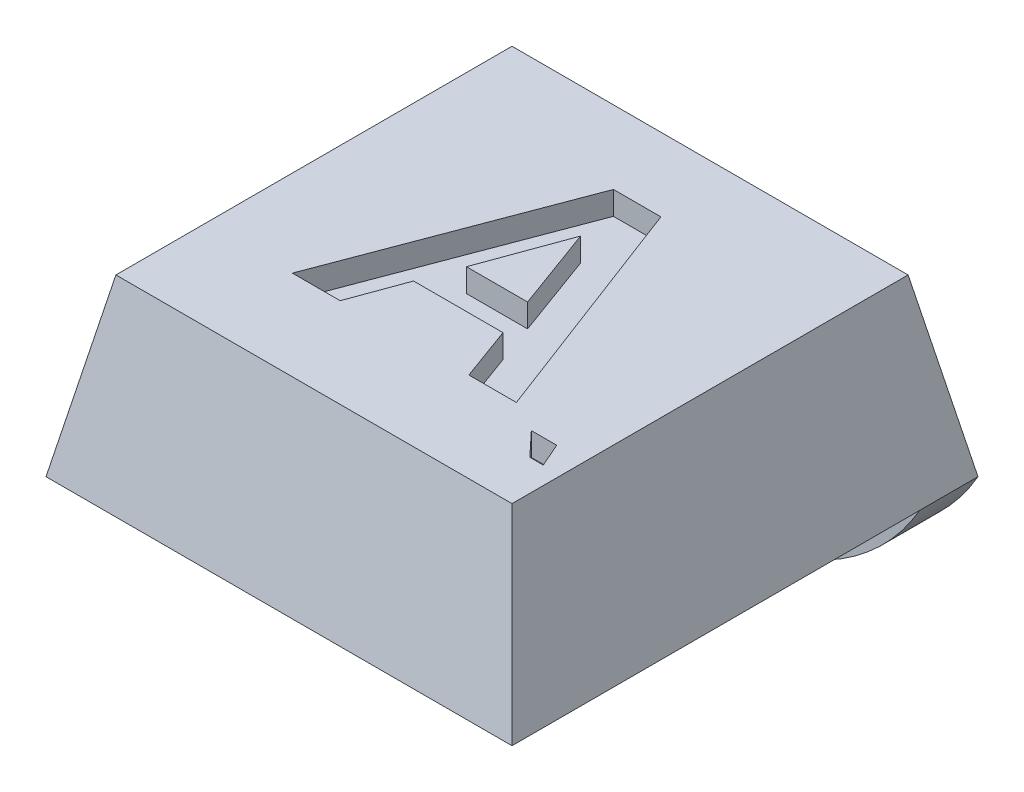
ISO-10303-21;
HEADER;
FILE_DESCRIPTION(('STEP AP214'),'2;1');
FILE_NAME('part.step','',(''),(''),'','','');
FILE_SCHEMA(('AUTOMOTIVE_DESIGN { 1 0 10303 214 1 1 1 1 }'));
ENDSEC;
DATA;
#1=APPLICATION_CONTEXT('core data for automotive mechanical design processes');
#2=APPLICATION_PROTOCOL_DEFINITION('international standard','automotive_design',2000,#1);
#3=PRODUCT_CONTEXT('',#1,'mechanical');
#4=PRODUCT('Part','Part','',(#3));
#5=PRODUCT_RELATED_PRODUCT_CATEGORY('part','',(#4));
#6=PRODUCT_DEFINITION_FORMATION('','',#4);
#7=PRODUCT_DEFINITION_CONTEXT('part definition',#1,'design');
#8=PRODUCT_DEFINITION('design','',#6,#7);
#9=PRODUCT_DEFINITION_SHAPE('','',#8);
#10=(LENGTH_UNIT() NAMED_UNIT(*) SI_UNIT(.MILLI.,.METRE.));
#11=(NAMED_UNIT(*) PLANE_ANGLE_UNIT() SI_UNIT($,.RADIAN.));
#12=(NAMED_UNIT(*) SI_UNIT($,.STERADIAN.) SOLID_ANGLE_UNIT());
#13=UNCERTAINTY_MEASURE_WITH_UNIT(LENGTH_MEASURE(1.E-05),#10,'distance_accuracy_value','');
#14=(GEOMETRIC_REPRESENTATION_CONTEXT(3) GLOBAL_UNCERTAINTY_ASSIGNED_CONTEXT((#13)) GLOBAL_UNIT_ASSIGNED_CONTEXT((#10,
#11,#12)) REPRESENTATION_CONTEXT('',''));
#15=CARTESIAN_POINT('',(0.,0.,0.));
#16=DIRECTION('',(0.,0.,1.));
#17=DIRECTION('',(1.,0.,0.));
#18=AXIS2_PLACEMENT_3D('',#15,#16,#17);
#19=CARTESIAN_POINT('',(0.,3.,0.));
#20=DIRECTION('',(0.,-1.,0.));
#21=DIRECTION('',(0.,0.,-1.));
#22=AXIS2_PLACEMENT_3D('',#19,#20,#21);
#23=PLANE('',#22);
#24=DIRECTION('',(0.355060662326772,0.,0.934843262835045));
#25=VECTOR('',#24,1.);
#26=CARTESIAN_POINT('',(4.41462653323797,3.,-6.14165206843505));
#27=LINE('',#26,#25);
#28=CARTESIAN_POINT('',(4.41462653323797,3.,-6.14165206843505));
#29=VERTEX_POINT('',#28);
#30=CARTESIAN_POINT('',(5.93385730246874,3.,-2.14165206843505));
#31=VERTEX_POINT('',#30);
#32=EDGE_CURVE('E66',#29,#31,#27,.T.);
#33=ORIENTED_EDGE('',*,*,#32,.T.);
#34=DIRECTION('',(-1.,0.,0.));
#35=VECTOR('',#34,1.);
#36=CARTESIAN_POINT('',(5.93385730246874,3.,-2.14165206843505));
#37=LINE('',#36,#35);
#38=CARTESIAN_POINT('',(5.11815217426361,3.,-2.14165206843505));
#39=VERTEX_POINT('',#38);
#40=EDGE_CURVE('E286',#31,#39,#37,.T.);
#41=ORIENTED_EDGE('',*,*,#40,.T.);
#42=DIRECTION('',(-0.343248282132193,0.,-0.939244705501872));
#43=VECTOR('',#42,1.);
#44=CARTESIAN_POINT('',(5.11815217426361,3.,-2.14165206843505));
#45=LINE('',#44,#43);
#46=CARTESIAN_POINT('',(4.78081243067387,3.,-3.06472899151198));
#47=VERTEX_POINT('',#46);
#48=EDGE_CURVE('E290',#39,#47,#45,.T.);
#49=ORIENTED_EDGE('',*,*,#48,.T.);
#50=DIRECTION('',(-1.,0.,0.));
#51=VECTOR('',#50,1.);
#52=CARTESIAN_POINT('',(4.78081243067387,3.,-3.06472899151198));
#53=LINE('',#52,#51);
#54=CARTESIAN_POINT('',(3.24555602041746,3.,-3.06472899151198));
#55=VERTEX_POINT('',#54);
#56=EDGE_CURVE('E294',#47,#55,#53,.T.);
#57=ORIENTED_EDGE('',*,*,#56,.T.);
#58=DIRECTION('',(-0.343248282132194,0.,0.939244705501872));
#59=VECTOR('',#58,1.);
#60=CARTESIAN_POINT('',(3.24555602041746,3.,-3.06472899151198));
#61=LINE('',#60,#59);
#62=CARTESIAN_POINT('',(2.90821627682771,3.,-2.14165206843505));
#63=VERTEX_POINT('',#62);
#64=EDGE_CURVE('E298',#55,#63,#61,.T.);
#65=ORIENTED_EDGE('',*,*,#64,.T.);
#66=DIRECTION('',(-1.,0.,0.));
#67=VECTOR('',#66,1.);
#68=CARTESIAN_POINT('',(2.90821627682771,3.,-2.14165206843505));
#69=LINE('',#68,#67);
#70=CARTESIAN_POINT('',(2.08770345631489,3.,-2.14165206843505));
#71=VERTEX_POINT('',#70);
#72=EDGE_CURVE('E302',#63,#71,#69,.T.);
#73=ORIENTED_EDGE('',*,*,#72,.T.);
#74=DIRECTION('',(0.353586403368764,0.,-0.935401868371419));
#75=VECTOR('',#74,1.);
#76=CARTESIAN_POINT('',(2.08770345631489,3.,-2.14165206843505));
#77=LINE('',#76,#75);
#78=CARTESIAN_POINT('',(3.59972268708412,3.,-6.14165206843505));
#79=VERTEX_POINT('',#78);
#80=EDGE_CURVE('E306',#71,#79,#77,.T.);
#81=ORIENTED_EDGE('',*,*,#80,.T.);
#82=DIRECTION('',(1.,0.,0.));
#83=VECTOR('',#82,1.);
#84=CARTESIAN_POINT('',(3.59972268708412,3.,-6.14165206843505));
#85=LINE('',#84,#83);
#86=EDGE_CURVE('E262',#79,#29,#85,.T.);
#87=ORIENTED_EDGE('',*,*,#86,.T.);
#88=EDGE_LOOP('',(#33,#41,#49,#57,#65,#73,#81,#87));
#89=FACE_BOUND('',#88,.T.);
#90=DIRECTION('',(-1.,0.,0.));
#91=VECTOR('',#90,1.);
#92=CARTESIAN_POINT('',(11.,3.,-0.6));
#93=LINE('',#92,#91);
#94=CARTESIAN_POINT('',(7.4,3.,-0.6));
#95=VERTEX_POINT('',#94);
#96=CARTESIAN_POINT('',(0.6,3.,-0.6));
#97=VERTEX_POINT('',#96);
#98=EDGE_CURVE('E361',#95,#97,#93,.T.);
#99=ORIENTED_EDGE('',*,*,#98,.F.);
#100=DIRECTION('',(0.,0.,1.));
#101=VECTOR('',#100,1.);
#102=CARTESIAN_POINT('',(7.4,3.,-8.));
#103=LINE('',#102,#101);
#104=CARTESIAN_POINT('',(7.4,3.,-7.4));
#105=VERTEX_POINT('',#104);
#106=EDGE_CURVE('E374',#105,#95,#103,.T.);
#107=ORIENTED_EDGE('',*,*,#106,.F.);
#108=DIRECTION('',(-1.,0.,0.));
#109=VECTOR('',#108,1.);
#110=CARTESIAN_POINT('',(11.,3.,-7.4));
#111=LINE('',#110,#109);
#112=CARTESIAN_POINT('',(0.599999999999999,3.,-7.4));
#113=VERTEX_POINT('',#112);
#114=EDGE_CURVE('E357',#105,#113,#111,.T.);
#115=ORIENTED_EDGE('',*,*,#114,.T.);
#116=DIRECTION('',(0.,0.,1.));
#117=VECTOR('',#116,1.);
#118=CARTESIAN_POINT('',(0.6,3.,-8.));
#119=LINE('',#118,#117);
#120=EDGE_CURVE('E377',#113,#97,#119,.T.);
#121=ORIENTED_EDGE('',*,*,#120,.T.);
#122=EDGE_LOOP('',(#99,#107,#115,#121));
#123=FACE_BOUND('',#122,.T.);
#124=DIRECTION('',(0.400818834019709,0.,0.916157334902188));
#125=VECTOR('',#124,1.);
#126=CARTESIAN_POINT('',(6.91610453258598,3.,-1.85152273990893));
#127=LINE('',#126,#125);
#128=CARTESIAN_POINT('',(6.91610453258598,3.,-1.85152273990893));
#129=VERTEX_POINT('',#128);
#130=CARTESIAN_POINT('',(7.09559171207316,3.,-1.44126632965252));
#131=VERTEX_POINT('',#130);
#132=EDGE_CURVE('E58',#129,#131,#127,.T.);
#133=ORIENTED_EDGE('',*,*,#132,.T.);
#134=DIRECTION('',(-1.,0.,0.));
#135=VECTOR('',#134,1.);
#136=CARTESIAN_POINT('',(7.09559171207316,3.,-1.44126632965252));
#137=LINE('',#136,#135);
#138=CARTESIAN_POINT('',(6.86482248130392,3.,-1.44126632965252));
#139=VERTEX_POINT('',#138);
#140=EDGE_CURVE('E214',#131,#139,#137,.T.);
#141=ORIENTED_EDGE('',*,*,#140,.T.);
#142=DIRECTION('',(-0.68394112888133,0.,-0.729537204140085));
#143=VECTOR('',#142,1.);
#144=CARTESIAN_POINT('',(6.86482248130392,3.,-1.44126632965252));
#145=LINE('',#144,#143);
#146=CARTESIAN_POINT('',(6.48020709668854,3.,-1.85152273990893));
#147=VERTEX_POINT('',#146);
#148=EDGE_CURVE('E481',#139,#147,#145,.T.);
#149=ORIENTED_EDGE('',*,*,#148,.T.);
#150=DIRECTION('',(1.,0.,0.));
#151=VECTOR('',#150,1.);
#152=CARTESIAN_POINT('',(6.48020709668854,3.,-1.85152273990893));
#153=LINE('',#152,#151);
#154=EDGE_CURVE('E210',#147,#129,#153,.T.);
#155=ORIENTED_EDGE('',*,*,#154,.T.);
#156=EDGE_LOOP('',(#133,#141,#149,#155));
#157=FACE_BOUND('',#156,.T.);
#158=ADVANCED_FACE('F42',(#89,#123,#157),#23,.F.);
#159=CARTESIAN_POINT('',(8.,0.,-8.));
#160=DIRECTION('',(-0.98058067569092,-0.196116135138184,0.));
#161=DIRECTION('',(0.196116135138184,-0.98058067569092,0.));
#162=AXIS2_PLACEMENT_3D('',#159,#160,#161);
#163=PLANE('',#162);
#164=DIRECTION('',(-0.192450089729875,0.962250448649376,-0.192450089729875));
#165=VECTOR('',#164,1.);
#166=CARTESIAN_POINT('',(7.7037037037037,1.48148148148148,-0.296296296296296));
#167=LINE('',#166,#165);
#168=CARTESIAN_POINT('',(8.,0.,0.));
#169=VERTEX_POINT('',#168);
#170=EDGE_CURVE('E371',#169,#95,#167,.T.);
#171=ORIENTED_EDGE('',*,*,#170,.F.);
#172=DIRECTION('',(0.,0.,-1.));
#173=VECTOR('',#172,1.);
#174=CARTESIAN_POINT('',(8.,0.,0.));
#175=LINE('',#174,#173);
#176=CARTESIAN_POINT('',(8.,0.,-7.));
#177=VERTEX_POINT('',#176);
#178=EDGE_CURVE('E390',#169,#177,#175,.T.);
#179=ORIENTED_EDGE('',*,*,#178,.T.);
#180=DIRECTION('',(0.,0.,1.));
#181=VECTOR('',#180,1.);
#182=CARTESIAN_POINT('',(8.,0.,-8.));
#183=LINE('',#182,#181);
#184=CARTESIAN_POINT('',(8.,0.,-8.));
#185=VERTEX_POINT('',#184);
#186=EDGE_CURVE('E336',#185,#177,#183,.T.);
#187=ORIENTED_EDGE('',*,*,#186,.F.);
#188=DIRECTION('',(0.192450089729875,-0.962250448649376,-0.192450089729875));
#189=VECTOR('',#188,1.);
#190=CARTESIAN_POINT('',(8.,0.,-8.));
#191=LINE('',#190,#189);
#192=EDGE_CURVE('E364',#105,#185,#191,.T.);
#193=ORIENTED_EDGE('',*,*,#192,.F.);
#194=ORIENTED_EDGE('',*,*,#106,.T.);
#195=EDGE_LOOP('',(#171,#179,#187,#193,#194));
#196=FACE_BOUND('',#195,.T.);
#197=ADVANCED_FACE('F463',(#196),#163,.F.);
#198=CARTESIAN_POINT('',(0.,0.,-8.));
#199=DIRECTION('',(0.98058067569092,-0.196116135138184,0.));
#200=DIRECTION('',(0.196116135138184,0.98058067569092,0.));
#201=AXIS2_PLACEMENT_3D('',#198,#199,#200);
#202=PLANE('',#201);
#203=DIRECTION('',(-0.192450089729875,-0.962250448649376,0.192450089729875));
#204=VECTOR('',#203,1.);
#205=CARTESIAN_POINT('',(0.296296296296296,1.48148148148148,-0.296296296296296));
#206=LINE('',#205,#204);
#207=CARTESIAN_POINT('',(0.,0.,0.));
#208=VERTEX_POINT('',#207);
#209=EDGE_CURVE('E418',#97,#208,#206,.T.);
#210=ORIENTED_EDGE('',*,*,#209,.F.);
#211=ORIENTED_EDGE('',*,*,#120,.F.);
#212=DIRECTION('',(0.192450089729875,0.962250448649376,0.192450089729875));
#213=VECTOR('',#212,1.);
#214=CARTESIAN_POINT('',(0.,0.,-8.));
#215=LINE('',#214,#213);
#216=CARTESIAN_POINT('',(0.,0.,-8.));
#217=VERTEX_POINT('',#216);
#218=EDGE_CURVE('E389',#217,#113,#215,.T.);
#219=ORIENTED_EDGE('',*,*,#218,.F.);
#220=DIRECTION('',(0.,0.,1.));
#221=VECTOR('',#220,1.);
#222=CARTESIAN_POINT('',(0.,0.,0.));
#223=LINE('',#222,#221);
#224=CARTESIAN_POINT('',(0.,0.,-7.));
#225=VERTEX_POINT('',#224);
#226=EDGE_CURVE('E394',#217,#225,#223,.T.);
#227=ORIENTED_EDGE('',*,*,#226,.T.);
#228=EDGE_CURVE('E381',#225,#208,#223,.T.);
#229=ORIENTED_EDGE('',*,*,#228,.T.);
#230=EDGE_LOOP('',(#210,#211,#219,#227,#229));
#231=FACE_BOUND('',#230,.T.);
#232=ADVANCED_FACE('F443',(#231),#202,.F.);
#233=CARTESIAN_POINT('',(0.,0.,0.));
#234=DIRECTION('',(0.,-1.,0.));
#235=DIRECTION('',(0.,0.,-1.));
#236=AXIS2_PLACEMENT_3D('',#233,#234,#235);
#237=PLANE('',#236);
#238=DIRECTION('',(-1.,0.,0.));
#239=VECTOR('',#238,1.);
#240=CARTESIAN_POINT('',(0.,0.,-7.));
#241=LINE('',#240,#239);
#242=EDGE_CURVE('E342',#177,#225,#241,.T.);
#243=ORIENTED_EDGE('',*,*,#242,.F.);
#244=ORIENTED_EDGE('',*,*,#178,.F.);
#245=DIRECTION('',(1.,0.,0.));
#246=VECTOR('',#245,1.);
#247=CARTESIAN_POINT('',(0.,0.,0.));
#248=LINE('',#247,#246);
#249=EDGE_CURVE('E391',#208,#169,#248,.T.);
#250=ORIENTED_EDGE('',*,*,#249,.F.);
#251=ORIENTED_EDGE('',*,*,#228,.F.);
#252=EDGE_LOOP('',(#243,#244,#250,#251));
#253=FACE_BOUND('',#252,.T.);
#254=CARTESIAN_POINT('',(4.,0.,-3.75));
#255=DIRECTION('',(0.,-1.,0.));
#256=DIRECTION('',(0.,0.,-1.));
#257=AXIS2_PLACEMENT_3D('',#254,#255,#256);
#258=CIRCLE('',#257,1.8);
#259=CARTESIAN_POINT('',(4.,0.,-5.55));
#260=VERTEX_POINT('',#259);
#261=EDGE_CURVE('E346',#260,#260,#258,.T.);
#262=ORIENTED_EDGE('',*,*,#261,.F.);
#263=EDGE_LOOP('',(#262));
#264=FACE_BOUND('',#263,.T.);
#265=ADVANCED_FACE('F458',(#253,#264),#237,.T.);
#266=CARTESIAN_POINT('',(11.,3.,-7.4));
#267=DIRECTION('',(0.,0.196116135138184,-0.98058067569092));
#268=DIRECTION('',(0.,0.98058067569092,0.196116135138184));
#269=AXIS2_PLACEMENT_3D('',#266,#267,#268);
#270=PLANE('',#269);
#271=ORIENTED_EDGE('',*,*,#192,.T.);
#272=DIRECTION('',(-1.,0.,0.));
#273=VECTOR('',#272,1.);
#274=CARTESIAN_POINT('',(0.,0.,-8.));
#275=LINE('',#274,#273);
#276=EDGE_CURVE('E385',#185,#217,#275,.T.);
#277=ORIENTED_EDGE('',*,*,#276,.T.);
#278=ORIENTED_EDGE('',*,*,#218,.T.);
#279=ORIENTED_EDGE('',*,*,#114,.F.);
#280=EDGE_LOOP('',(#271,#277,#278,#279));
#281=FACE_BOUND('',#280,.T.);
#282=ADVANCED_FACE('F438',(#281),#270,.T.);
#283=CARTESIAN_POINT('',(11.,0.,0.));
#284=DIRECTION('',(0.,0.196116135138184,0.98058067569092));
#285=DIRECTION('',(0.,-0.98058067569092,0.196116135138184));
#286=AXIS2_PLACEMENT_3D('',#283,#284,#285);
#287=PLANE('',#286);
#288=ORIENTED_EDGE('',*,*,#170,.T.);
#289=ORIENTED_EDGE('',*,*,#98,.T.);
#290=ORIENTED_EDGE('',*,*,#209,.T.);
#291=ORIENTED_EDGE('',*,*,#249,.T.);
#292=EDGE_LOOP('',(#288,#289,#290,#291));
#293=FACE_BOUND('',#292,.T.);
#294=ADVANCED_FACE('F467',(#293),#287,.T.);
#295=CARTESIAN_POINT('',(4.,0.8,-3.75));
#296=DIRECTION('',(0.,-1.,0.));
#297=DIRECTION('',(0.,0.,-1.));
#298=AXIS2_PLACEMENT_3D('',#295,#296,#297);
#299=CYLINDRICAL_SURFACE('',#298,1.8);
#300=CARTESIAN_POINT('',(4.,0.8,-3.75));
#301=DIRECTION('',(0.,-1.,0.));
#302=DIRECTION('',(0.,0.,-1.));
#303=AXIS2_PLACEMENT_3D('',#300,#301,#302);
#304=CIRCLE('',#303,1.8);
#305=CARTESIAN_POINT('',(4.,0.8,-5.55));
#306=VERTEX_POINT('',#305);
#307=EDGE_CURVE('E353',#306,#306,#304,.T.);
#308=ORIENTED_EDGE('',*,*,#307,.F.);
#309=EDGE_LOOP('',(#308));
#310=FACE_BOUND('',#309,.T.);
#311=ORIENTED_EDGE('',*,*,#261,.T.);
#312=EDGE_LOOP('',(#311));
#313=FACE_BOUND('',#312,.T.);
#314=ADVANCED_FACE('F570',(#310,#313),#299,.F.);
#315=CARTESIAN_POINT('',(4.,0.8,-3.75));
#316=DIRECTION('',(0.,-1.,0.));
#317=DIRECTION('',(0.,0.,-1.));
#318=AXIS2_PLACEMENT_3D('',#315,#316,#317);
#319=PLANE('',#318);
#320=ORIENTED_EDGE('',*,*,#307,.T.);
#321=EDGE_LOOP('',(#320));
#322=FACE_BOUND('',#321,.T.);
#323=ADVANCED_FACE('F567',(#322),#319,.T.);
#324=CARTESIAN_POINT('',(0.,-2.,-8.));
#325=DIRECTION('',(0.,0.,1.));
#326=DIRECTION('',(1.,0.,0.));
#327=AXIS2_PLACEMENT_3D('',#324,#325,#326);
#328=PLANE('',#327);
#329=ORIENTED_EDGE('',*,*,#276,.F.);
#330=CARTESIAN_POINT('',(4.53589838486225,2.,-8.));
#331=DIRECTION('',(0.,0.,1.));
#332=DIRECTION('',(1.,0.,0.));
#333=AXIS2_PLACEMENT_3D('',#330,#331,#332);
#334=CIRCLE('',#333,4.);
#335=CARTESIAN_POINT('',(4.53589838486225,-2.,-8.));
#336=VERTEX_POINT('',#335);
#337=EDGE_CURVE('E11',#185,#336,#334,.F.);
#338=ORIENTED_EDGE('',*,*,#337,.T.);
#339=DIRECTION('',(1.,0.,0.));
#340=VECTOR('',#339,1.);
#341=CARTESIAN_POINT('',(0.,-2.,-8.));
#342=LINE('',#341,#340);
#343=CARTESIAN_POINT('',(3.46410161513775,-2.,-8.));
#344=VERTEX_POINT('',#343);
#345=EDGE_CURVE('E337',#344,#336,#342,.T.);
#346=ORIENTED_EDGE('',*,*,#345,.F.);
#347=CARTESIAN_POINT('',(3.46410161513775,2.,-8.));
#348=DIRECTION('',(0.,0.,1.));
#349=DIRECTION('',(1.,0.,0.));
#350=AXIS2_PLACEMENT_3D('',#347,#348,#349);
#351=CIRCLE('',#350,4.);
#352=EDGE_CURVE('E51',#344,#217,#351,.F.);
#353=ORIENTED_EDGE('',*,*,#352,.T.);
#354=EDGE_LOOP('',(#329,#338,#346,#353));
#355=FACE_BOUND('',#354,.T.);
#356=ADVANCED_FACE('F431',(#355),#328,.F.);
#357=CARTESIAN_POINT('',(0.,-2.,-7.));
#358=DIRECTION('',(0.,0.,-1.));
#359=DIRECTION('',(-1.,0.,0.));
#360=AXIS2_PLACEMENT_3D('',#357,#358,#359);
#361=PLANE('',#360);
#362=DIRECTION('',(-1.,0.,0.));
#363=VECTOR('',#362,1.);
#364=CARTESIAN_POINT('',(0.,-2.,-7.));
#365=LINE('',#364,#363);
#366=CARTESIAN_POINT('',(4.53589838486225,-2.,-7.));
#367=VERTEX_POINT('',#366);
#368=CARTESIAN_POINT('',(3.46410161513775,-2.,-7.));
#369=VERTEX_POINT('',#368);
#370=EDGE_CURVE('E341',#367,#369,#365,.T.);
#371=ORIENTED_EDGE('',*,*,#370,.F.);
#372=CARTESIAN_POINT('',(4.53589838486225,2.,-7.));
#373=DIRECTION('',(0.,0.,-1.));
#374=DIRECTION('',(-1.,0.,0.));
#375=AXIS2_PLACEMENT_3D('',#372,#373,#374);
#376=CIRCLE('',#375,4.);
#377=EDGE_CURVE('E425',#367,#177,#376,.F.);
#378=ORIENTED_EDGE('',*,*,#377,.T.);
#379=ORIENTED_EDGE('',*,*,#242,.T.);
#380=CARTESIAN_POINT('',(3.46410161513775,2.,-7.));
#381=DIRECTION('',(0.,0.,-1.));
#382=DIRECTION('',(-1.,0.,0.));
#383=AXIS2_PLACEMENT_3D('',#380,#381,#382);
#384=CIRCLE('',#383,4.);
#385=EDGE_CURVE('E422',#225,#369,#384,.F.);
#386=ORIENTED_EDGE('',*,*,#385,.T.);
#387=EDGE_LOOP('',(#371,#378,#379,#386));
#388=FACE_BOUND('',#387,.T.);
#389=ADVANCED_FACE('F449',(#388),#361,.F.);
#390=CARTESIAN_POINT('',(0.,-2.,0.));
#391=DIRECTION('',(0.,1.,0.));
#392=DIRECTION('',(0.,0.,1.));
#393=AXIS2_PLACEMENT_3D('',#390,#391,#392);
#394=PLANE('',#393);
#395=ORIENTED_EDGE('',*,*,#345,.T.);
#396=DIRECTION('',(0.,0.,1.));
#397=VECTOR('',#396,1.);
#398=CARTESIAN_POINT('',(4.53589838486225,-2.,0.));
#399=LINE('',#398,#397);
#400=EDGE_CURVE('E417',#336,#367,#399,.T.);
#401=ORIENTED_EDGE('',*,*,#400,.T.);
#402=ORIENTED_EDGE('',*,*,#370,.T.);
#403=DIRECTION('',(0.,0.,-1.));
#404=VECTOR('',#403,1.);
#405=CARTESIAN_POINT('',(3.46410161513775,-2.,0.));
#406=LINE('',#405,#404);
#407=EDGE_CURVE('E413',#369,#344,#406,.T.);
#408=ORIENTED_EDGE('',*,*,#407,.T.);
#409=EDGE_LOOP('',(#395,#401,#402,#408));
#410=FACE_BOUND('',#409,.T.);
#411=ADVANCED_FACE('F452',(#410),#394,.F.);
#412=CARTESIAN_POINT('',(4.53589838486225,2.,-8.));
#413=DIRECTION('',(0.,0.,1.));
#414=DIRECTION('',(1.,0.,0.));
#415=AXIS2_PLACEMENT_3D('',#412,#413,#414);
#416=CYLINDRICAL_SURFACE('',#415,4.);
#417=ORIENTED_EDGE('',*,*,#337,.F.);
#418=ORIENTED_EDGE('',*,*,#186,.T.);
#419=ORIENTED_EDGE('',*,*,#377,.F.);
#420=ORIENTED_EDGE('',*,*,#400,.F.);
#421=EDGE_LOOP('',(#417,#418,#419,#420));
#422=FACE_BOUND('',#421,.T.);
#423=ADVANCED_FACE('F455',(#422),#416,.T.);
#424=CARTESIAN_POINT('',(3.46410161513775,2.,-8.));
#425=DIRECTION('',(0.,0.,-1.));
#426=DIRECTION('',(-1.,0.,0.));
#427=AXIS2_PLACEMENT_3D('',#424,#425,#426);
#428=CYLINDRICAL_SURFACE('',#427,4.);
#429=ORIENTED_EDGE('',*,*,#385,.F.);
#430=ORIENTED_EDGE('',*,*,#226,.F.);
#431=ORIENTED_EDGE('',*,*,#352,.F.);
#432=ORIENTED_EDGE('',*,*,#407,.F.);
#433=EDGE_LOOP('',(#429,#430,#431,#432));
#434=FACE_BOUND('',#433,.T.);
#435=ADVANCED_FACE('F44',(#434),#428,.T.);
#436=CARTESIAN_POINT('',(4.41462653323797,2.6,-6.14165206843505));
#437=DIRECTION('',(-0.934843262835046,0.,0.355060662326772));
#438=DIRECTION('',(0.355060662326772,0.,0.934843262835046));
#439=AXIS2_PLACEMENT_3D('',#436,#437,#438);
#440=PLANE('',#439);
#441=ORIENTED_EDGE('',*,*,#32,.F.);
#442=DIRECTION('',(0.,1.,0.));
#443=VECTOR('',#442,1.);
#444=CARTESIAN_POINT('',(4.41462653323797,2.6,-6.14165206843505));
#445=LINE('',#444,#443);
#446=CARTESIAN_POINT('',(4.41462653323797,2.6,-6.14165206843505));
#447=VERTEX_POINT('',#446);
#448=EDGE_CURVE('E283',#447,#29,#445,.T.);
#449=ORIENTED_EDGE('',*,*,#448,.F.);
#450=DIRECTION('',(0.355060662326772,0.,0.934843262835045));
#451=VECTOR('',#450,1.);
#452=CARTESIAN_POINT('',(4.41462653323797,2.6,-6.14165206843505));
#453=LINE('',#452,#451);
#454=CARTESIAN_POINT('',(5.93385730246874,2.6,-2.14165206843505));
#455=VERTEX_POINT('',#454);
#456=EDGE_CURVE('E257',#447,#455,#453,.T.);
#457=ORIENTED_EDGE('',*,*,#456,.T.);
#458=DIRECTION('',(0.,1.,0.));
#459=VECTOR('',#458,1.);
#460=CARTESIAN_POINT('',(5.93385730246874,2.6,-2.14165206843505));
#461=LINE('',#460,#459);
#462=EDGE_CURVE('E333',#455,#31,#461,.T.);
#463=ORIENTED_EDGE('',*,*,#462,.T.);
#464=EDGE_LOOP('',(#441,#449,#457,#463));
#465=FACE_BOUND('',#464,.T.);
#466=ADVANCED_FACE('F557',(#465),#440,.T.);
#467=CARTESIAN_POINT('',(5.93385730246874,2.6,-2.14165206843505));
#468=DIRECTION('',(0.,0.,-1.));
#469=DIRECTION('',(-1.,0.,0.));
#470=AXIS2_PLACEMENT_3D('',#467,#468,#469);
#471=PLANE('',#470);
#472=ORIENTED_EDGE('',*,*,#40,.F.);
#473=ORIENTED_EDGE('',*,*,#462,.F.);
#474=DIRECTION('',(-1.,0.,0.));
#475=VECTOR('',#474,1.);
#476=CARTESIAN_POINT('',(5.93385730246874,2.6,-2.14165206843505));
#477=LINE('',#476,#475);
#478=CARTESIAN_POINT('',(5.11815217426361,2.6,-2.14165206843505));
#479=VERTEX_POINT('',#478);
#480=EDGE_CURVE('E261',#455,#479,#477,.T.);
#481=ORIENTED_EDGE('',*,*,#480,.T.);
#482=DIRECTION('',(0.,1.,0.));
#483=VECTOR('',#482,1.);
#484=CARTESIAN_POINT('',(5.11815217426361,2.6,-2.14165206843505));
#485=LINE('',#484,#483);
#486=EDGE_CURVE('E330',#479,#39,#485,.T.);
#487=ORIENTED_EDGE('',*,*,#486,.T.);
#488=EDGE_LOOP('',(#472,#473,#481,#487));
#489=FACE_BOUND('',#488,.T.);
#490=ADVANCED_FACE('F553',(#489),#471,.T.);
#491=CARTESIAN_POINT('',(5.11815217426361,2.6,-2.14165206843505));
#492=DIRECTION('',(0.939244705501872,0.,-0.343248282132193));
#493=DIRECTION('',(-0.343248282132193,0.,-0.939244705501872));
#494=AXIS2_PLACEMENT_3D('',#491,#492,#493);
#495=PLANE('',#494);
#496=ORIENTED_EDGE('',*,*,#48,.F.);
#497=ORIENTED_EDGE('',*,*,#486,.F.);
#498=DIRECTION('',(-0.343248282132193,0.,-0.939244705501872));
#499=VECTOR('',#498,1.);
#500=CARTESIAN_POINT('',(5.11815217426361,2.6,-2.14165206843505));
#501=LINE('',#500,#499);
#502=CARTESIAN_POINT('',(4.78081243067387,2.6,-3.06472899151198));
#503=VERTEX_POINT('',#502);
#504=EDGE_CURVE('E265',#479,#503,#501,.T.);
#505=ORIENTED_EDGE('',*,*,#504,.T.);
#506=DIRECTION('',(0.,1.,0.));
#507=VECTOR('',#506,1.);
#508=CARTESIAN_POINT('',(4.78081243067387,2.6,-3.06472899151198));
#509=LINE('',#508,#507);
#510=EDGE_CURVE('E327',#503,#47,#509,.T.);
#511=ORIENTED_EDGE('',*,*,#510,.T.);
#512=EDGE_LOOP('',(#496,#497,#505,#511));
#513=FACE_BOUND('',#512,.T.);
#514=ADVANCED_FACE('F549',(#513),#495,.T.);
#515=CARTESIAN_POINT('',(4.78081243067387,2.6,-3.06472899151198));
#516=DIRECTION('',(0.,0.,-1.));
#517=DIRECTION('',(-1.,0.,0.));
#518=AXIS2_PLACEMENT_3D('',#515,#516,#517);
#519=PLANE('',#518);
#520=ORIENTED_EDGE('',*,*,#56,.F.);
#521=ORIENTED_EDGE('',*,*,#510,.F.);
#522=DIRECTION('',(-1.,0.,0.));
#523=VECTOR('',#522,1.);
#524=CARTESIAN_POINT('',(4.78081243067387,2.6,-3.06472899151198));
#525=LINE('',#524,#523);
#526=CARTESIAN_POINT('',(3.24555602041746,2.6,-3.06472899151198));
#527=VERTEX_POINT('',#526);
#528=EDGE_CURVE('E268',#503,#527,#525,.T.);
#529=ORIENTED_EDGE('',*,*,#528,.T.);
#530=DIRECTION('',(0.,1.,0.));
#531=VECTOR('',#530,1.);
#532=CARTESIAN_POINT('',(3.24555602041746,2.6,-3.06472899151198));
#533=LINE('',#532,#531);
#534=EDGE_CURVE('E324',#527,#55,#533,.T.);
#535=ORIENTED_EDGE('',*,*,#534,.T.);
#536=EDGE_LOOP('',(#520,#521,#529,#535));
#537=FACE_BOUND('',#536,.T.);
#538=ADVANCED_FACE('F545',(#537),#519,.T.);
#539=CARTESIAN_POINT('',(3.24555602041746,2.6,-3.06472899151198));
#540=DIRECTION('',(-0.939244705501871,0.,-0.343248282132194));
#541=DIRECTION('',(-0.343248282132194,0.,0.939244705501872));
#542=AXIS2_PLACEMENT_3D('',#539,#540,#541);
#543=PLANE('',#542);
#544=ORIENTED_EDGE('',*,*,#64,.F.);
#545=ORIENTED_EDGE('',*,*,#534,.F.);
#546=DIRECTION('',(-0.343248282132194,0.,0.939244705501872));
#547=VECTOR('',#546,1.);
#548=CARTESIAN_POINT('',(3.24555602041746,2.6,-3.06472899151198));
#549=LINE('',#548,#547);
#550=CARTESIAN_POINT('',(2.90821627682771,2.6,-2.14165206843505));
#551=VERTEX_POINT('',#550);
#552=EDGE_CURVE('E271',#527,#551,#549,.T.);
#553=ORIENTED_EDGE('',*,*,#552,.T.);
#554=DIRECTION('',(0.,1.,0.));
#555=VECTOR('',#554,1.);
#556=CARTESIAN_POINT('',(2.90821627682771,2.6,-2.14165206843505));
#557=LINE('',#556,#555);
#558=EDGE_CURVE('E321',#551,#63,#557,.T.);
#559=ORIENTED_EDGE('',*,*,#558,.T.);
#560=EDGE_LOOP('',(#544,#545,#553,#559));
#561=FACE_BOUND('',#560,.T.);
#562=ADVANCED_FACE('F541',(#561),#543,.T.);
#563=CARTESIAN_POINT('',(2.90821627682771,2.6,-2.14165206843505));
#564=DIRECTION('',(0.,0.,-1.));
#565=DIRECTION('',(-1.,0.,0.));
#566=AXIS2_PLACEMENT_3D('',#563,#564,#565);
#567=PLANE('',#566);
#568=ORIENTED_EDGE('',*,*,#72,.F.);
#569=ORIENTED_EDGE('',*,*,#558,.F.);
#570=DIRECTION('',(-1.,0.,0.));
#571=VECTOR('',#570,1.);
#572=CARTESIAN_POINT('',(2.90821627682771,2.6,-2.14165206843505));
#573=LINE('',#572,#571);
#574=CARTESIAN_POINT('',(2.08770345631489,2.6,-2.14165206843505));
#575=VERTEX_POINT('',#574);
#576=EDGE_CURVE('E274',#551,#575,#573,.T.);
#577=ORIENTED_EDGE('',*,*,#576,.T.);
#578=DIRECTION('',(0.,1.,0.));
#579=VECTOR('',#578,1.);
#580=CARTESIAN_POINT('',(2.08770345631489,2.6,-2.14165206843505));
#581=LINE('',#580,#579);
#582=EDGE_CURVE('E318',#575,#71,#581,.T.);
#583=ORIENTED_EDGE('',*,*,#582,.T.);
#584=EDGE_LOOP('',(#568,#569,#577,#583));
#585=FACE_BOUND('',#584,.T.);
#586=ADVANCED_FACE('F537',(#585),#567,.T.);
#587=CARTESIAN_POINT('',(2.08770345631489,2.6,-2.14165206843505));
#588=DIRECTION('',(0.935401868371419,0.,0.353586403368764));
#589=DIRECTION('',(0.353586403368764,0.,-0.935401868371419));
#590=AXIS2_PLACEMENT_3D('',#587,#588,#589);
#591=PLANE('',#590);
#592=ORIENTED_EDGE('',*,*,#80,.F.);
#593=ORIENTED_EDGE('',*,*,#582,.F.);
#594=DIRECTION('',(0.353586403368764,0.,-0.935401868371419));
#595=VECTOR('',#594,1.);
#596=CARTESIAN_POINT('',(2.08770345631489,2.6,-2.14165206843505));
#597=LINE('',#596,#595);
#598=CARTESIAN_POINT('',(3.59972268708412,2.6,-6.14165206843505));
#599=VERTEX_POINT('',#598);
#600=EDGE_CURVE('E277',#575,#599,#597,.T.);
#601=ORIENTED_EDGE('',*,*,#600,.T.);
#602=DIRECTION('',(0.,1.,0.));
#603=VECTOR('',#602,1.);
#604=CARTESIAN_POINT('',(3.59972268708412,2.6,-6.14165206843505));
#605=LINE('',#604,#603);
#606=EDGE_CURVE('E315',#599,#79,#605,.T.);
#607=ORIENTED_EDGE('',*,*,#606,.T.);
#608=EDGE_LOOP('',(#592,#593,#601,#607));
#609=FACE_BOUND('',#608,.T.);
#610=ADVANCED_FACE('F533',(#609),#591,.T.);
#611=CARTESIAN_POINT('',(3.59972268708412,2.6,-6.14165206843505));
#612=DIRECTION('',(0.,0.,1.));
#613=DIRECTION('',(1.,0.,0.));
#614=AXIS2_PLACEMENT_3D('',#611,#612,#613);
#615=PLANE('',#614);
#616=ORIENTED_EDGE('',*,*,#86,.F.);
#617=ORIENTED_EDGE('',*,*,#606,.F.);
#618=DIRECTION('',(1.,0.,0.));
#619=VECTOR('',#618,1.);
#620=CARTESIAN_POINT('',(3.59972268708412,2.6,-6.14165206843505));
#621=LINE('',#620,#619);
#622=EDGE_CURVE('E280',#599,#447,#621,.T.);
#623=ORIENTED_EDGE('',*,*,#622,.T.);
#624=ORIENTED_EDGE('',*,*,#448,.T.);
#625=EDGE_LOOP('',(#616,#617,#623,#624));
#626=FACE_BOUND('',#625,.T.);
#627=ADVANCED_FACE('F529',(#626),#615,.T.);
#628=CARTESIAN_POINT('',(0.,2.6,0.));
#629=DIRECTION('',(0.,-1.,0.));
#630=DIRECTION('',(0.,0.,-1.));
#631=AXIS2_PLACEMENT_3D('',#628,#629,#630);
#632=PLANE('',#631);
#633=DIRECTION('',(1.,0.,0.));
#634=VECTOR('',#633,1.);
#635=CARTESIAN_POINT('',(3.48674191785335,2.6,-3.73139565817864));
#636=LINE('',#635,#634);
#637=CARTESIAN_POINT('',(3.48674191785335,2.6,-3.73139565817864));
#638=VERTEX_POINT('',#637);
#639=CARTESIAN_POINT('',(4.53642140503284,2.6,-3.73139565817864));
#640=VERTEX_POINT('',#639);
#641=EDGE_CURVE('E228',#638,#640,#636,.T.);
#642=ORIENTED_EDGE('',*,*,#641,.F.);
#643=DIRECTION('',(-0.342837179853215,0.,0.939394841432661));
#644=VECTOR('',#643,1.);
#645=CARTESIAN_POINT('',(4.01078037939182,2.6,-5.16729309407608));
#646=LINE('',#645,#644);
#647=CARTESIAN_POINT('',(4.01078037939182,2.6,-5.16729309407608));
#648=VERTEX_POINT('',#647);
#649=EDGE_CURVE('E237',#648,#638,#646,.T.);
#650=ORIENTED_EDGE('',*,*,#649,.F.);
#651=DIRECTION('',(-0.343761882683262,0.,-0.939056850256713));
#652=VECTOR('',#651,1.);
#653=CARTESIAN_POINT('',(4.53642140503284,2.6,-3.73139565817864));
#654=LINE('',#653,#652);
#655=EDGE_CURVE('E232',#640,#648,#654,.T.);
#656=ORIENTED_EDGE('',*,*,#655,.F.);
#657=EDGE_LOOP('',(#642,#650,#656));
#658=FACE_BOUND('',#657,.T.);
#659=ORIENTED_EDGE('',*,*,#456,.F.);
#660=ORIENTED_EDGE('',*,*,#622,.F.);
#661=ORIENTED_EDGE('',*,*,#600,.F.);
#662=ORIENTED_EDGE('',*,*,#576,.F.);
#663=ORIENTED_EDGE('',*,*,#552,.F.);
#664=ORIENTED_EDGE('',*,*,#528,.F.);
#665=ORIENTED_EDGE('',*,*,#504,.F.);
#666=ORIENTED_EDGE('',*,*,#480,.F.);
#667=EDGE_LOOP('',(#659,#660,#661,#662,#663,#664,#665,#666));
#668=FACE_BOUND('',#667,.T.);
#669=ADVANCED_FACE('F525',(#658,#668),#632,.F.);
#670=CARTESIAN_POINT('',(3.48674191785335,2.6,-3.73139565817864));
#671=DIRECTION('',(0.,0.,1.));
#672=DIRECTION('',(1.,0.,0.));
#673=AXIS2_PLACEMENT_3D('',#670,#671,#672);
#674=PLANE('',#673);
#675=DIRECTION('',(1.,0.,0.));
#676=VECTOR('',#675,1.);
#677=CARTESIAN_POINT('',(3.48674191785335,3.,-3.73139565817864));
#678=LINE('',#677,#676);
#679=CARTESIAN_POINT('',(3.48674191785335,3.,-3.73139565817864));
#680=VERTEX_POINT('',#679);
#681=CARTESIAN_POINT('',(4.53642140503284,3.,-3.73139565817864));
#682=VERTEX_POINT('',#681);
#683=EDGE_CURVE('E216',#680,#682,#678,.T.);
#684=ORIENTED_EDGE('',*,*,#683,.F.);
#685=DIRECTION('',(0.,1.,0.));
#686=VECTOR('',#685,1.);
#687=CARTESIAN_POINT('',(3.48674191785335,2.6,-3.73139565817864));
#688=LINE('',#687,#686);
#689=EDGE_CURVE('E248',#638,#680,#688,.T.);
#690=ORIENTED_EDGE('',*,*,#689,.F.);
#691=ORIENTED_EDGE('',*,*,#641,.T.);
#692=DIRECTION('',(0.,1.,0.));
#693=VECTOR('',#692,1.);
#694=CARTESIAN_POINT('',(4.53642140503284,2.6,-3.73139565817864));
#695=LINE('',#694,#693);
#696=EDGE_CURVE('E240',#640,#682,#695,.T.);
#697=ORIENTED_EDGE('',*,*,#696,.T.);
#698=EDGE_LOOP('',(#684,#690,#691,#697));
#699=FACE_BOUND('',#698,.T.);
#700=ADVANCED_FACE('F518',(#699),#674,.T.);
#701=CARTESIAN_POINT('',(4.01078037939182,2.6,-5.16729309407608));
#702=DIRECTION('',(-0.939394841432661,0.,-0.342837179853215));
#703=DIRECTION('',(-0.342837179853215,0.,0.939394841432661));
#704=AXIS2_PLACEMENT_3D('',#701,#702,#703);
#705=PLANE('',#704);
#706=DIRECTION('',(-0.342837179853215,0.,0.939394841432661));
#707=VECTOR('',#706,1.);
#708=CARTESIAN_POINT('',(4.01078037939182,3.,-5.16729309407608));
#709=LINE('',#708,#707);
#710=CARTESIAN_POINT('',(4.01078037939182,3.,-5.16729309407608));
#711=VERTEX_POINT('',#710);
#712=EDGE_CURVE('E233',#711,#680,#709,.T.);
#713=ORIENTED_EDGE('',*,*,#712,.F.);
#714=DIRECTION('',(0.,1.,0.));
#715=VECTOR('',#714,1.);
#716=CARTESIAN_POINT('',(4.01078037939182,2.6,-5.16729309407608));
#717=LINE('',#716,#715);
#718=EDGE_CURVE('E251',#648,#711,#717,.T.);
#719=ORIENTED_EDGE('',*,*,#718,.F.);
#720=ORIENTED_EDGE('',*,*,#649,.T.);
#721=ORIENTED_EDGE('',*,*,#689,.T.);
#722=EDGE_LOOP('',(#713,#719,#720,#721));
#723=FACE_BOUND('',#722,.T.);
#724=ADVANCED_FACE('F514',(#723),#705,.T.);
#725=CARTESIAN_POINT('',(4.53642140503284,2.6,-3.73139565817864));
#726=DIRECTION('',(0.939056850256713,0.,-0.343761882683262));
#727=DIRECTION('',(-0.343761882683262,0.,-0.939056850256713));
#728=AXIS2_PLACEMENT_3D('',#725,#726,#727);
#729=PLANE('',#728);
#730=DIRECTION('',(-0.343761882683262,0.,-0.939056850256713));
#731=VECTOR('',#730,1.);
#732=CARTESIAN_POINT('',(4.53642140503284,3.,-3.73139565817864));
#733=LINE('',#732,#731);
#734=EDGE_CURVE('E222',#682,#711,#733,.T.);
#735=ORIENTED_EDGE('',*,*,#734,.F.);
#736=ORIENTED_EDGE('',*,*,#696,.F.);
#737=ORIENTED_EDGE('',*,*,#655,.T.);
#738=ORIENTED_EDGE('',*,*,#718,.T.);
#739=EDGE_LOOP('',(#735,#736,#737,#738));
#740=FACE_BOUND('',#739,.T.);
#741=ADVANCED_FACE('F517',(#740),#729,.T.);
#742=ORIENTED_EDGE('',*,*,#683,.T.);
#743=ORIENTED_EDGE('',*,*,#734,.T.);
#744=ORIENTED_EDGE('',*,*,#712,.T.);
#745=EDGE_LOOP('',(#742,#743,#744));
#746=FACE_BOUND('',#745,.T.);
#747=ADVANCED_FACE('F474',(#746),#23,.F.);
#748=CARTESIAN_POINT('',(6.91610453258598,2.6,-1.85152273990893));
#749=DIRECTION('',(-0.916157334902189,0.,0.400818834019709));
#750=DIRECTION('',(0.400818834019709,0.,0.916157334902189));
#751=AXIS2_PLACEMENT_3D('',#748,#749,#750);
#752=PLANE('',#751);
#753=ORIENTED_EDGE('',*,*,#132,.F.);
#754=DIRECTION('',(0.,1.,0.));
#755=VECTOR('',#754,1.);
#756=CARTESIAN_POINT('',(6.91610453258598,2.6,-1.85152273990893));
#757=LINE('',#756,#755);
#758=CARTESIAN_POINT('',(6.91610453258598,2.6,-1.85152273990893));
#759=VERTEX_POINT('',#758);
#760=EDGE_CURVE('E208',#759,#129,#757,.T.);
#761=ORIENTED_EDGE('',*,*,#760,.F.);
#762=DIRECTION('',(0.400818834019709,0.,0.916157334902188));
#763=VECTOR('',#762,1.);
#764=CARTESIAN_POINT('',(6.91610453258598,2.6,-1.85152273990893));
#765=LINE('',#764,#763);
#766=CARTESIAN_POINT('',(7.09559171207316,2.6,-1.44126632965252));
#767=VERTEX_POINT('',#766);
#768=EDGE_CURVE('E199',#759,#767,#765,.T.);
#769=ORIENTED_EDGE('',*,*,#768,.T.);
#770=DIRECTION('',(0.,1.,0.));
#771=VECTOR('',#770,1.);
#772=CARTESIAN_POINT('',(7.09559171207316,2.6,-1.44126632965252));
#773=LINE('',#772,#771);
#774=EDGE_CURVE('E207',#767,#131,#773,.T.);
#775=ORIENTED_EDGE('',*,*,#774,.T.);
#776=EDGE_LOOP('',(#753,#761,#769,#775));
#777=FACE_BOUND('',#776,.T.);
#778=ADVANCED_FACE('F206',(#777),#752,.T.);
#779=CARTESIAN_POINT('',(7.09559171207316,2.6,-1.44126632965252));
#780=DIRECTION('',(0.,0.,-1.));
#781=DIRECTION('',(-1.,0.,0.));
#782=AXIS2_PLACEMENT_3D('',#779,#780,#781);
#783=PLANE('',#782);
#784=ORIENTED_EDGE('',*,*,#140,.F.);
#785=ORIENTED_EDGE('',*,*,#774,.F.);
#786=DIRECTION('',(-1.,0.,0.));
#787=VECTOR('',#786,1.);
#788=CARTESIAN_POINT('',(7.09559171207316,2.6,-1.44126632965252));
#789=LINE('',#788,#787);
#790=CARTESIAN_POINT('',(6.86482248130392,2.6,-1.44126632965252));
#791=VERTEX_POINT('',#790);
#792=EDGE_CURVE('E195',#767,#791,#789,.T.);
#793=ORIENTED_EDGE('',*,*,#792,.T.);
#794=DIRECTION('',(0.,1.,0.));
#795=VECTOR('',#794,1.);
#796=CARTESIAN_POINT('',(6.86482248130392,2.6,-1.44126632965252));
#797=LINE('',#796,#795);
#798=EDGE_CURVE('E217',#791,#139,#797,.T.);
#799=ORIENTED_EDGE('',*,*,#798,.T.);
#800=EDGE_LOOP('',(#784,#785,#793,#799));
#801=FACE_BOUND('',#800,.T.);
#802=ADVANCED_FACE('F212',(#801),#783,.T.);
#803=CARTESIAN_POINT('',(6.86482248130392,2.6,-1.44126632965252));
#804=DIRECTION('',(0.729537204140085,0.,-0.68394112888133));
#805=DIRECTION('',(-0.68394112888133,0.,-0.729537204140085));
#806=AXIS2_PLACEMENT_3D('',#803,#804,#805);
#807=PLANE('',#806);
#808=ORIENTED_EDGE('',*,*,#148,.F.);
#809=ORIENTED_EDGE('',*,*,#798,.F.);
#810=DIRECTION('',(-0.68394112888133,0.,-0.729537204140085));
#811=VECTOR('',#810,1.);
#812=CARTESIAN_POINT('',(6.86482248130392,2.6,-1.44126632965252));
#813=LINE('',#812,#811);
#814=CARTESIAN_POINT('',(6.48020709668854,2.6,-1.85152273990893));
#815=VERTEX_POINT('',#814);
#816=EDGE_CURVE('E200',#791,#815,#813,.T.);
#817=ORIENTED_EDGE('',*,*,#816,.T.);
#818=DIRECTION('',(0.,1.,0.));
#819=VECTOR('',#818,1.);
#820=CARTESIAN_POINT('',(6.48020709668854,2.6,-1.85152273990893));
#821=LINE('',#820,#819);
#822=EDGE_CURVE('E224',#815,#147,#821,.T.);
#823=ORIENTED_EDGE('',*,*,#822,.T.);
#824=EDGE_LOOP('',(#808,#809,#817,#823));
#825=FACE_BOUND('',#824,.T.);
#826=ADVANCED_FACE('F496',(#825),#807,.T.);
#827=CARTESIAN_POINT('',(6.48020709668854,2.6,-1.85152273990893));
#828=DIRECTION('',(0.,0.,1.));
#829=DIRECTION('',(1.,0.,0.));
#830=AXIS2_PLACEMENT_3D('',#827,#828,#829);
#831=PLANE('',#830);
#832=ORIENTED_EDGE('',*,*,#154,.F.);
#833=ORIENTED_EDGE('',*,*,#822,.F.);
#834=DIRECTION('',(1.,0.,0.));
#835=VECTOR('',#834,1.);
#836=CARTESIAN_POINT('',(6.48020709668854,2.6,-1.85152273990893));
#837=LINE('',#836,#835);
#838=EDGE_CURVE('E484',#815,#759,#837,.T.);
#839=ORIENTED_EDGE('',*,*,#838,.T.);
#840=ORIENTED_EDGE('',*,*,#760,.T.);
#841=EDGE_LOOP('',(#832,#833,#839,#840));
#842=FACE_BOUND('',#841,.T.);
#843=ADVANCED_FACE('F498',(#842),#831,.T.);
#844=CARTESIAN_POINT('',(0.,2.6,0.));
#845=DIRECTION('',(0.,-1.,0.));
#846=DIRECTION('',(0.,0.,-1.));
#847=AXIS2_PLACEMENT_3D('',#844,#845,#846);
#848=PLANE('',#847);
#849=ORIENTED_EDGE('',*,*,#768,.F.);
#850=ORIENTED_EDGE('',*,*,#838,.F.);
#851=ORIENTED_EDGE('',*,*,#816,.F.);
#852=ORIENTED_EDGE('',*,*,#792,.F.);
#853=EDGE_LOOP('',(#849,#850,#851,#852));
#854=FACE_BOUND('',#853,.T.);
#855=ADVANCED_FACE('F197',(#854),#848,.F.);
#856=CLOSED_SHELL('',(#158,#197,#232,#265,#282,#294,#314,#323,#356,#389,#411,#423,#435,#466,
#490,#514,#538,#562,#586,#610,#627,#669,#700,#724,#741,#747,#778,#802,#826,#843,#855));
#857=MANIFOLD_SOLID_BREP('B2',#856);
#858=ADVANCED_BREP_SHAPE_REPRESENTATION('',(#18,#857),#14);
#859=SHAPE_DEFINITION_REPRESENTATION(#9,#858);
ENDSEC;
END-ISO-10303-21;
